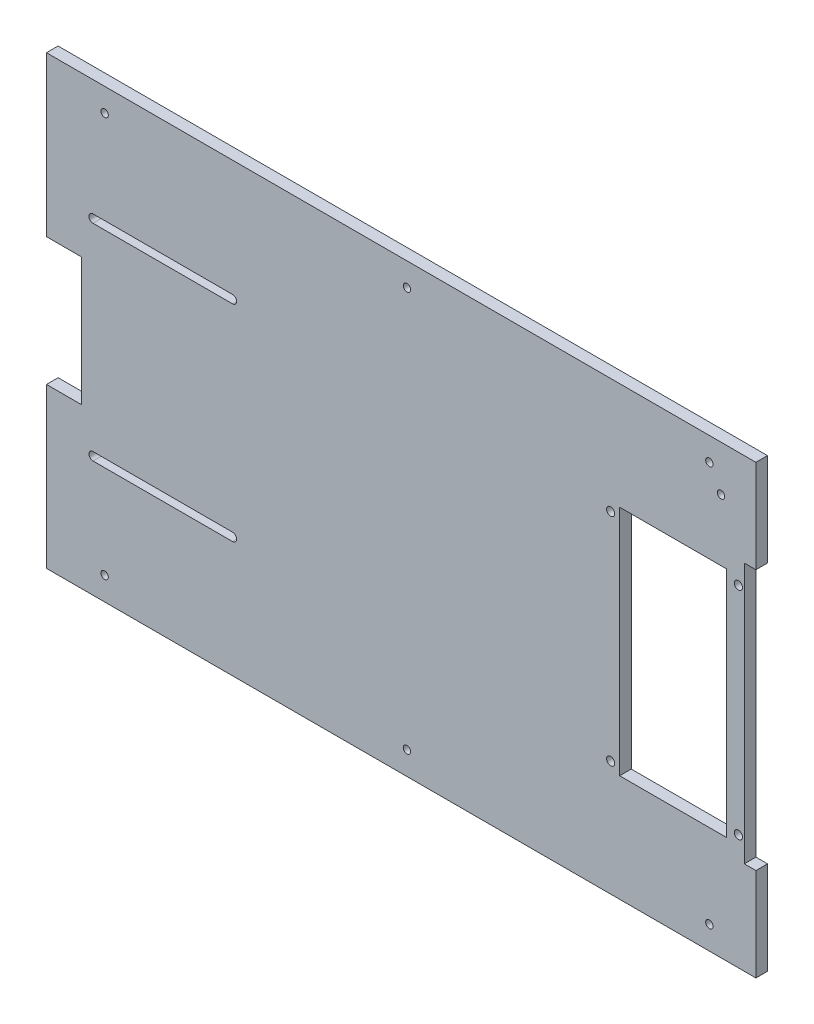
ISO-10303-21;
HEADER;
FILE_DESCRIPTION(('STEP AP214'),'2;1');
FILE_NAME('part.step','',(''),(''),'','','');
FILE_SCHEMA(('AUTOMOTIVE_DESIGN { 1 0 10303 214 1 1 1 1 }'));
ENDSEC;
DATA;
#1=APPLICATION_CONTEXT('core data for automotive mechanical design processes');
#2=APPLICATION_PROTOCOL_DEFINITION('international standard','automotive_design',2000,#1);
#3=PRODUCT_CONTEXT('',#1,'mechanical');
#4=PRODUCT('Part','Part','',(#3));
#5=PRODUCT_RELATED_PRODUCT_CATEGORY('part','',(#4));
#6=PRODUCT_DEFINITION_FORMATION('','',#4);
#7=PRODUCT_DEFINITION_CONTEXT('part definition',#1,'design');
#8=PRODUCT_DEFINITION('design','',#6,#7);
#9=PRODUCT_DEFINITION_SHAPE('','',#8);
#10=(LENGTH_UNIT() NAMED_UNIT(*) SI_UNIT(.MILLI.,.METRE.));
#11=(NAMED_UNIT(*) PLANE_ANGLE_UNIT() SI_UNIT($,.RADIAN.));
#12=(NAMED_UNIT(*) SI_UNIT($,.STERADIAN.) SOLID_ANGLE_UNIT());
#13=UNCERTAINTY_MEASURE_WITH_UNIT(LENGTH_MEASURE(1.E-05),#10,'distance_accuracy_value','');
#14=(GEOMETRIC_REPRESENTATION_CONTEXT(3) GLOBAL_UNCERTAINTY_ASSIGNED_CONTEXT((#13)) GLOBAL_UNIT_ASSIGNED_CONTEXT((#10,
#11,#12)) REPRESENTATION_CONTEXT('',''));
#15=CARTESIAN_POINT('',(0.,0.,0.));
#16=DIRECTION('',(0.,0.,1.));
#17=DIRECTION('',(1.,0.,0.));
#18=AXIS2_PLACEMENT_3D('',#15,#16,#17);
#19=CARTESIAN_POINT('',(150.,96.,5.));
#20=DIRECTION('',(-1.,0.,0.));
#21=DIRECTION('',(0.,-1.,0.));
#22=AXIS2_PLACEMENT_3D('',#19,#20,#21);
#23=PLANE('',#22);
#24=DIRECTION('',(0.,1.,0.));
#25=VECTOR('',#24,1.);
#26=CARTESIAN_POINT('',(150.,96.,5.));
#27=LINE('',#26,#25);
#28=CARTESIAN_POINT('',(150.,-56.,5.));
#29=VERTEX_POINT('',#28);
#30=CARTESIAN_POINT('',(150.,56.,5.));
#31=VERTEX_POINT('',#30);
#32=EDGE_CURVE('E49',#29,#31,#27,.T.);
#33=ORIENTED_EDGE('',*,*,#32,.F.);
#34=DIRECTION('',(0.,0.,-1.));
#35=VECTOR('',#34,1.);
#36=CARTESIAN_POINT('',(150.,-56.,45.3112887414927));
#37=LINE('',#36,#35);
#38=CARTESIAN_POINT('',(150.,-56.,0.));
#39=VERTEX_POINT('',#38);
#40=EDGE_CURVE('E218',#29,#39,#37,.T.);
#41=ORIENTED_EDGE('',*,*,#40,.T.);
#42=DIRECTION('',(0.,1.,0.));
#43=VECTOR('',#42,1.);
#44=CARTESIAN_POINT('',(150.,96.,0.));
#45=LINE('',#44,#43);
#46=CARTESIAN_POINT('',(150.,56.,0.));
#47=VERTEX_POINT('',#46);
#48=EDGE_CURVE('E432',#39,#47,#45,.T.);
#49=ORIENTED_EDGE('',*,*,#48,.T.);
#50=DIRECTION('',(0.,0.,-1.));
#51=VECTOR('',#50,1.);
#52=CARTESIAN_POINT('',(150.,56.,45.3112887414927));
#53=LINE('',#52,#51);
#54=EDGE_CURVE('E242',#31,#47,#53,.T.);
#55=ORIENTED_EDGE('',*,*,#54,.F.);
#56=EDGE_LOOP('',(#33,#41,#49,#55));
#57=FACE_BOUND('',#56,.T.);
#58=ADVANCED_FACE('F35',(#57),#23,.F.);
#59=CARTESIAN_POINT('',(-150.,96.,5.));
#60=DIRECTION('',(1.,0.,0.));
#61=DIRECTION('',(0.,0.,-1.));
#62=AXIS2_PLACEMENT_3D('',#59,#60,#61);
#63=PLANE('',#62);
#64=DIRECTION('',(0.,-1.,0.));
#65=VECTOR('',#64,1.);
#66=CARTESIAN_POINT('',(-150.,96.,5.));
#67=LINE('',#66,#65);
#68=CARTESIAN_POINT('',(-150.,-27.5,5.));
#69=VERTEX_POINT('',#68);
#70=CARTESIAN_POINT('',(-150.,-96.,5.));
#71=VERTEX_POINT('',#70);
#72=EDGE_CURVE('E438',#69,#71,#67,.T.);
#73=ORIENTED_EDGE('',*,*,#72,.F.);
#74=DIRECTION('',(0.,0.,1.));
#75=VECTOR('',#74,1.);
#76=CARTESIAN_POINT('',(-150.,-27.5,0.));
#77=LINE('',#76,#75);
#78=CARTESIAN_POINT('',(-150.,-27.5,0.));
#79=VERTEX_POINT('',#78);
#80=EDGE_CURVE('E373',#79,#69,#77,.T.);
#81=ORIENTED_EDGE('',*,*,#80,.F.);
#82=DIRECTION('',(0.,-1.,0.));
#83=VECTOR('',#82,1.);
#84=CARTESIAN_POINT('',(-150.,96.,0.));
#85=LINE('',#84,#83);
#86=CARTESIAN_POINT('',(-150.,-96.,0.));
#87=VERTEX_POINT('',#86);
#88=EDGE_CURVE('E447',#79,#87,#85,.T.);
#89=ORIENTED_EDGE('',*,*,#88,.T.);
#90=DIRECTION('',(0.,0.,-1.));
#91=VECTOR('',#90,1.);
#92=CARTESIAN_POINT('',(-150.,-96.,5.));
#93=LINE('',#92,#91);
#94=EDGE_CURVE('E42',#71,#87,#93,.T.);
#95=ORIENTED_EDGE('',*,*,#94,.F.);
#96=EDGE_LOOP('',(#73,#81,#89,#95));
#97=FACE_BOUND('',#96,.T.);
#98=ADVANCED_FACE('F454',(#97),#63,.F.);
#99=CARTESIAN_POINT('',(-150.,96.,5.));
#100=DIRECTION('',(0.,-1.,0.));
#101=DIRECTION('',(0.,0.,-1.));
#102=AXIS2_PLACEMENT_3D('',#99,#100,#101);
#103=PLANE('',#102);
#104=DIRECTION('',(-1.,0.,0.));
#105=VECTOR('',#104,1.);
#106=CARTESIAN_POINT('',(-150.,96.,0.));
#107=LINE('',#106,#105);
#108=CARTESIAN_POINT('',(155.,96.,0.));
#109=VERTEX_POINT('',#108);
#110=CARTESIAN_POINT('',(-150.,96.,0.));
#111=VERTEX_POINT('',#110);
#112=EDGE_CURVE('E445',#109,#111,#107,.T.);
#113=ORIENTED_EDGE('',*,*,#112,.T.);
#114=DIRECTION('',(0.,0.,-1.));
#115=VECTOR('',#114,1.);
#116=CARTESIAN_POINT('',(-150.,96.,5.));
#117=LINE('',#116,#115);
#118=CARTESIAN_POINT('',(-150.,96.,5.));
#119=VERTEX_POINT('',#118);
#120=EDGE_CURVE('E11',#119,#111,#117,.T.);
#121=ORIENTED_EDGE('',*,*,#120,.F.);
#122=DIRECTION('',(-1.,0.,0.));
#123=VECTOR('',#122,1.);
#124=CARTESIAN_POINT('',(-150.,96.,5.));
#125=LINE('',#124,#123);
#126=CARTESIAN_POINT('',(155.,96.,5.));
#127=VERTEX_POINT('',#126);
#128=EDGE_CURVE('E436',#127,#119,#125,.T.);
#129=ORIENTED_EDGE('',*,*,#128,.F.);
#130=DIRECTION('',(0.,0.,-1.));
#131=VECTOR('',#130,1.);
#132=CARTESIAN_POINT('',(155.,96.,45.3112887414927));
#133=LINE('',#132,#131);
#134=EDGE_CURVE('E236',#127,#109,#133,.T.);
#135=ORIENTED_EDGE('',*,*,#134,.T.);
#136=EDGE_LOOP('',(#113,#121,#129,#135));
#137=FACE_BOUND('',#136,.T.);
#138=ADVANCED_FACE('F471',(#137),#103,.F.);
#139=CARTESIAN_POINT('',(-150.,27.5,0.));
#140=VERTEX_POINT('',#139);
#141=EDGE_CURVE('E204',#111,#140,#85,.T.);
#142=ORIENTED_EDGE('',*,*,#141,.T.);
#143=DIRECTION('',(0.,0.,1.));
#144=VECTOR('',#143,1.);
#145=CARTESIAN_POINT('',(-150.,27.5,0.));
#146=LINE('',#145,#144);
#147=CARTESIAN_POINT('',(-150.,27.5,5.));
#148=VERTEX_POINT('',#147);
#149=EDGE_CURVE('E375',#140,#148,#146,.T.);
#150=ORIENTED_EDGE('',*,*,#149,.T.);
#151=EDGE_CURVE('E439',#119,#148,#67,.T.);
#152=ORIENTED_EDGE('',*,*,#151,.F.);
#153=ORIENTED_EDGE('',*,*,#120,.T.);
#154=EDGE_LOOP('',(#142,#150,#152,#153));
#155=FACE_BOUND('',#154,.T.);
#156=ADVANCED_FACE('F484',(#155),#63,.F.);
#157=CARTESIAN_POINT('',(-150.,-96.,5.));
#158=DIRECTION('',(0.,1.,0.));
#159=DIRECTION('',(0.,0.,1.));
#160=AXIS2_PLACEMENT_3D('',#157,#158,#159);
#161=PLANE('',#160);
#162=DIRECTION('',(1.,0.,0.));
#163=VECTOR('',#162,1.);
#164=CARTESIAN_POINT('',(-150.,-96.,0.));
#165=LINE('',#164,#163);
#166=CARTESIAN_POINT('',(155.,-96.,0.));
#167=VERTEX_POINT('',#166);
#168=EDGE_CURVE('E194',#87,#167,#165,.T.);
#169=ORIENTED_EDGE('',*,*,#168,.T.);
#170=DIRECTION('',(0.,0.,-1.));
#171=VECTOR('',#170,1.);
#172=CARTESIAN_POINT('',(155.,-96.,45.3112887414927));
#173=LINE('',#172,#171);
#174=CARTESIAN_POINT('',(155.,-96.,5.));
#175=VERTEX_POINT('',#174);
#176=EDGE_CURVE('E198',#175,#167,#173,.T.);
#177=ORIENTED_EDGE('',*,*,#176,.F.);
#178=DIRECTION('',(1.,0.,0.));
#179=VECTOR('',#178,1.);
#180=CARTESIAN_POINT('',(-150.,-96.,5.));
#181=LINE('',#180,#179);
#182=EDGE_CURVE('E442',#71,#175,#181,.T.);
#183=ORIENTED_EDGE('',*,*,#182,.F.);
#184=ORIENTED_EDGE('',*,*,#94,.T.);
#185=EDGE_LOOP('',(#169,#177,#183,#184));
#186=FACE_BOUND('',#185,.T.);
#187=ADVANCED_FACE('F196',(#186),#161,.F.);
#188=CARTESIAN_POINT('',(0.,0.,5.));
#189=DIRECTION('',(0.,0.,1.));
#190=DIRECTION('',(1.,0.,0.));
#191=AXIS2_PLACEMENT_3D('',#188,#189,#190);
#192=PLANE('',#191);
#193=CARTESIAN_POINT('',(140.000000000001,76.5,5.));
#194=DIRECTION('',(0.,0.,-1.));
#195=DIRECTION('',(-1.,0.,0.));
#196=AXIS2_PLACEMENT_3D('',#193,#194,#195);
#197=CIRCLE('',#196,1.59999999999999);
#198=CARTESIAN_POINT('',(138.400000000001,76.5,5.));
#199=VERTEX_POINT('',#198);
#200=EDGE_CURVE('E222',#199,#199,#197,.T.);
#201=ORIENTED_EDGE('',*,*,#200,.T.);
#202=EDGE_LOOP('',(#201));
#203=FACE_BOUND('',#202,.T.);
#204=CARTESIAN_POINT('',(135.,-86.,5.));
#205=DIRECTION('',(0.,0.,-1.));
#206=DIRECTION('',(1.,0.,0.));
#207=AXIS2_PLACEMENT_3D('',#204,#205,#206);
#208=CIRCLE('',#207,1.59999999999999);
#209=CARTESIAN_POINT('',(136.6,-86.,5.));
#210=VERTEX_POINT('',#209);
#211=EDGE_CURVE('E278',#210,#210,#208,.T.);
#212=ORIENTED_EDGE('',*,*,#211,.T.);
#213=EDGE_LOOP('',(#212));
#214=FACE_BOUND('',#213,.T.);
#215=CARTESIAN_POINT('',(5.,-86.,5.));
#216=DIRECTION('',(0.,0.,-1.));
#217=DIRECTION('',(1.,0.,0.));
#218=AXIS2_PLACEMENT_3D('',#215,#216,#217);
#219=CIRCLE('',#218,1.59999999999999);
#220=CARTESIAN_POINT('',(6.6,-86.,5.));
#221=VERTEX_POINT('',#220);
#222=EDGE_CURVE('E272',#221,#221,#219,.T.);
#223=ORIENTED_EDGE('',*,*,#222,.T.);
#224=EDGE_LOOP('',(#223));
#225=FACE_BOUND('',#224,.T.);
#226=CARTESIAN_POINT('',(-125.,-86.,5.));
#227=DIRECTION('',(0.,0.,-1.));
#228=DIRECTION('',(1.,0.,0.));
#229=AXIS2_PLACEMENT_3D('',#226,#227,#228);
#230=CIRCLE('',#229,1.59999999999999);
#231=CARTESIAN_POINT('',(-123.4,-86.,5.));
#232=VERTEX_POINT('',#231);
#233=EDGE_CURVE('E266',#232,#232,#230,.T.);
#234=ORIENTED_EDGE('',*,*,#233,.T.);
#235=EDGE_LOOP('',(#234));
#236=FACE_BOUND('',#235,.T.);
#237=CARTESIAN_POINT('',(-125.,86.,5.));
#238=DIRECTION('',(0.,0.,-1.));
#239=DIRECTION('',(-1.,0.,0.));
#240=AXIS2_PLACEMENT_3D('',#237,#238,#239);
#241=CIRCLE('',#240,1.59999999999999);
#242=CARTESIAN_POINT('',(-126.6,86.,5.));
#243=VERTEX_POINT('',#242);
#244=EDGE_CURVE('E260',#243,#243,#241,.T.);
#245=ORIENTED_EDGE('',*,*,#244,.T.);
#246=EDGE_LOOP('',(#245));
#247=FACE_BOUND('',#246,.T.);
#248=CARTESIAN_POINT('',(5.,86.,5.));
#249=DIRECTION('',(0.,0.,-1.));
#250=DIRECTION('',(-1.,0.,0.));
#251=AXIS2_PLACEMENT_3D('',#248,#249,#250);
#252=CIRCLE('',#251,1.59999999999999);
#253=CARTESIAN_POINT('',(3.40000000000001,86.,5.));
#254=VERTEX_POINT('',#253);
#255=EDGE_CURVE('E253',#254,#254,#252,.T.);
#256=ORIENTED_EDGE('',*,*,#255,.T.);
#257=EDGE_LOOP('',(#256));
#258=FACE_BOUND('',#257,.T.);
#259=CARTESIAN_POINT('',(135.,86.,5.));
#260=DIRECTION('',(0.,0.,-1.));
#261=DIRECTION('',(-1.,0.,0.));
#262=AXIS2_PLACEMENT_3D('',#259,#260,#261);
#263=CIRCLE('',#262,1.59999999999999);
#264=CARTESIAN_POINT('',(133.4,86.,5.));
#265=VERTEX_POINT('',#264);
#266=EDGE_CURVE('E283',#265,#265,#263,.T.);
#267=ORIENTED_EDGE('',*,*,#266,.T.);
#268=EDGE_LOOP('',(#267));
#269=FACE_BOUND('',#268,.T.);
#270=CARTESIAN_POINT('',(-70.,44.25,5.));
#271=DIRECTION('',(0.,0.,1.));
#272=DIRECTION('',(1.,0.,0.));
#273=AXIS2_PLACEMENT_3D('',#270,#271,#272);
#274=CIRCLE('',#273,1.75000000000001);
#275=CARTESIAN_POINT('',(-70.,42.5,5.));
#276=VERTEX_POINT('',#275);
#277=CARTESIAN_POINT('',(-70.,46.,5.));
#278=VERTEX_POINT('',#277);
#279=EDGE_CURVE('E303',#276,#278,#274,.T.);
#280=ORIENTED_EDGE('',*,*,#279,.F.);
#281=DIRECTION('',(1.,0.,0.));
#282=VECTOR('',#281,1.);
#283=CARTESIAN_POINT('',(-70.,42.5,5.));
#284=LINE('',#283,#282);
#285=CARTESIAN_POINT('',(-130.,42.5,5.));
#286=VERTEX_POINT('',#285);
#287=EDGE_CURVE('E293',#286,#276,#284,.T.);
#288=ORIENTED_EDGE('',*,*,#287,.F.);
#289=CARTESIAN_POINT('',(-130.,44.25,5.));
#290=DIRECTION('',(0.,0.,1.));
#291=DIRECTION('',(1.,0.,0.));
#292=AXIS2_PLACEMENT_3D('',#289,#290,#291);
#293=CIRCLE('',#292,1.75000000000001);
#294=CARTESIAN_POINT('',(-130.,46.,5.));
#295=VERTEX_POINT('',#294);
#296=EDGE_CURVE('E309',#295,#286,#293,.T.);
#297=ORIENTED_EDGE('',*,*,#296,.F.);
#298=DIRECTION('',(-1.,0.,0.));
#299=VECTOR('',#298,1.);
#300=CARTESIAN_POINT('',(-70.,46.,5.));
#301=LINE('',#300,#299);
#302=EDGE_CURVE('E305',#278,#295,#301,.T.);
#303=ORIENTED_EDGE('',*,*,#302,.F.);
#304=EDGE_LOOP('',(#280,#288,#297,#303));
#305=FACE_BOUND('',#304,.T.);
#306=CARTESIAN_POINT('',(-70.,-44.25,5.));
#307=DIRECTION('',(0.,0.,1.));
#308=DIRECTION('',(-1.,0.,0.));
#309=AXIS2_PLACEMENT_3D('',#306,#307,#308);
#310=CIRCLE('',#309,1.75000000000001);
#311=CARTESIAN_POINT('',(-70.,-46.,5.));
#312=VERTEX_POINT('',#311);
#313=CARTESIAN_POINT('',(-70.,-42.5,5.));
#314=VERTEX_POINT('',#313);
#315=EDGE_CURVE('E337',#312,#314,#310,.T.);
#316=ORIENTED_EDGE('',*,*,#315,.F.);
#317=DIRECTION('',(1.,0.,0.));
#318=VECTOR('',#317,1.);
#319=CARTESIAN_POINT('',(-70.,-46.,5.));
#320=LINE('',#319,#318);
#321=CARTESIAN_POINT('',(-130.,-46.,5.));
#322=VERTEX_POINT('',#321);
#323=EDGE_CURVE('E327',#322,#312,#320,.T.);
#324=ORIENTED_EDGE('',*,*,#323,.F.);
#325=CARTESIAN_POINT('',(-130.,-44.25,5.));
#326=DIRECTION('',(0.,0.,1.));
#327=DIRECTION('',(-1.,0.,0.));
#328=AXIS2_PLACEMENT_3D('',#325,#326,#327);
#329=CIRCLE('',#328,1.75000000000001);
#330=CARTESIAN_POINT('',(-130.,-42.5,5.));
#331=VERTEX_POINT('',#330);
#332=EDGE_CURVE('E343',#331,#322,#329,.T.);
#333=ORIENTED_EDGE('',*,*,#332,.F.);
#334=DIRECTION('',(-1.,0.,0.));
#335=VECTOR('',#334,1.);
#336=CARTESIAN_POINT('',(-70.,-42.5,5.));
#337=LINE('',#336,#335);
#338=EDGE_CURVE('E339',#314,#331,#337,.T.);
#339=ORIENTED_EDGE('',*,*,#338,.F.);
#340=EDGE_LOOP('',(#316,#324,#333,#339));
#341=FACE_BOUND('',#340,.T.);
#342=DIRECTION('',(1.,0.,0.));
#343=VECTOR('',#342,1.);
#344=CARTESIAN_POINT('',(-135.,-27.5,5.));
#345=LINE('',#344,#343);
#346=CARTESIAN_POINT('',(-135.,-27.5,5.));
#347=VERTEX_POINT('',#346);
#348=EDGE_CURVE('E359',#69,#347,#345,.T.);
#349=ORIENTED_EDGE('',*,*,#348,.F.);
#350=ORIENTED_EDGE('',*,*,#72,.T.);
#351=ORIENTED_EDGE('',*,*,#182,.T.);
#352=DIRECTION('',(0.,-1.,0.));
#353=VECTOR('',#352,1.);
#354=CARTESIAN_POINT('',(155.,-96.,5.));
#355=LINE('',#354,#353);
#356=CARTESIAN_POINT('',(155.,-56.,5.));
#357=VERTEX_POINT('',#356);
#358=EDGE_CURVE('E211',#357,#175,#355,.T.);
#359=ORIENTED_EDGE('',*,*,#358,.F.);
#360=DIRECTION('',(1.,0.,0.));
#361=VECTOR('',#360,1.);
#362=CARTESIAN_POINT('',(150.,-56.,5.));
#363=LINE('',#362,#361);
#364=EDGE_CURVE('E220',#29,#357,#363,.T.);
#365=ORIENTED_EDGE('',*,*,#364,.F.);
#366=ORIENTED_EDGE('',*,*,#32,.T.);
#367=DIRECTION('',(-1.,0.,0.));
#368=VECTOR('',#367,1.);
#369=CARTESIAN_POINT('',(150.,56.,5.));
#370=LINE('',#369,#368);
#371=CARTESIAN_POINT('',(155.,56.,5.));
#372=VERTEX_POINT('',#371);
#373=EDGE_CURVE('E239',#372,#31,#370,.T.);
#374=ORIENTED_EDGE('',*,*,#373,.F.);
#375=DIRECTION('',(0.,-1.,0.));
#376=VECTOR('',#375,1.);
#377=CARTESIAN_POINT('',(155.,96.,5.));
#378=LINE('',#377,#376);
#379=EDGE_CURVE('E244',#127,#372,#378,.T.);
#380=ORIENTED_EDGE('',*,*,#379,.F.);
#381=ORIENTED_EDGE('',*,*,#128,.T.);
#382=ORIENTED_EDGE('',*,*,#151,.T.);
#383=DIRECTION('',(-1.,0.,0.));
#384=VECTOR('',#383,1.);
#385=CARTESIAN_POINT('',(-135.,27.5,5.));
#386=LINE('',#385,#384);
#387=CARTESIAN_POINT('',(-135.,27.5,5.));
#388=VERTEX_POINT('',#387);
#389=EDGE_CURVE('E368',#388,#148,#386,.T.);
#390=ORIENTED_EDGE('',*,*,#389,.F.);
#391=DIRECTION('',(0.,1.,0.));
#392=VECTOR('',#391,1.);
#393=CARTESIAN_POINT('',(-135.,27.5,5.));
#394=LINE('',#393,#392);
#395=EDGE_CURVE('E286',#347,#388,#394,.T.);
#396=ORIENTED_EDGE('',*,*,#395,.F.);
#397=EDGE_LOOP('',(#349,#350,#351,#359,#365,#366,#374,#380,#381,#382,#390,#396));
#398=FACE_BOUND('',#397,.T.);
#399=DIRECTION('',(0.,-1.,0.));
#400=VECTOR('',#399,1.);
#401=CARTESIAN_POINT('',(96.4149907175586,50.,5.));
#402=LINE('',#401,#400);
#403=CARTESIAN_POINT('',(96.4149907175586,50.,5.));
#404=VERTEX_POINT('',#403);
#405=CARTESIAN_POINT('',(96.4149907175586,-50.,5.));
#406=VERTEX_POINT('',#405);
#407=EDGE_CURVE('E316',#404,#406,#402,.T.);
#408=ORIENTED_EDGE('',*,*,#407,.F.);
#409=DIRECTION('',(-1.,0.,0.));
#410=VECTOR('',#409,1.);
#411=CARTESIAN_POINT('',(142.414990717559,50.,5.));
#412=LINE('',#411,#410);
#413=CARTESIAN_POINT('',(142.414990717559,50.,5.));
#414=VERTEX_POINT('',#413);
#415=EDGE_CURVE('E383',#414,#404,#412,.T.);
#416=ORIENTED_EDGE('',*,*,#415,.F.);
#417=DIRECTION('',(0.,1.,0.));
#418=VECTOR('',#417,1.);
#419=CARTESIAN_POINT('',(142.414990717559,50.,5.));
#420=LINE('',#419,#418);
#421=CARTESIAN_POINT('',(142.414990717559,-50.,5.));
#422=VERTEX_POINT('',#421);
#423=EDGE_CURVE('E397',#422,#414,#420,.T.);
#424=ORIENTED_EDGE('',*,*,#423,.F.);
#425=DIRECTION('',(1.,0.,0.));
#426=VECTOR('',#425,1.);
#427=CARTESIAN_POINT('',(142.414990717559,-50.,5.));
#428=LINE('',#427,#426);
#429=EDGE_CURVE('E394',#406,#422,#428,.T.);
#430=ORIENTED_EDGE('',*,*,#429,.F.);
#431=EDGE_LOOP('',(#408,#416,#424,#430));
#432=FACE_BOUND('',#431,.T.);
#433=CARTESIAN_POINT('',(147.46,-46.46,5.));
#434=DIRECTION('',(0.,0.,-1.));
#435=DIRECTION('',(-1.,0.,0.));
#436=AXIS2_PLACEMENT_3D('',#433,#434,#435);
#437=CIRCLE('',#436,1.75000000000001);
#438=CARTESIAN_POINT('',(145.71,-46.46,5.));
#439=VERTEX_POINT('',#438);
#440=EDGE_CURVE('E417',#439,#439,#437,.T.);
#441=ORIENTED_EDGE('',*,*,#440,.T.);
#442=EDGE_LOOP('',(#441));
#443=FACE_BOUND('',#442,.T.);
#444=CARTESIAN_POINT('',(92.5400000000001,46.46,5.));
#445=DIRECTION('',(0.,0.,-1.));
#446=DIRECTION('',(-1.,0.,0.));
#447=AXIS2_PLACEMENT_3D('',#444,#445,#446);
#448=CIRCLE('',#447,1.75);
#449=CARTESIAN_POINT('',(90.7900000000001,46.46,5.));
#450=VERTEX_POINT('',#449);
#451=EDGE_CURVE('E424',#450,#450,#448,.T.);
#452=ORIENTED_EDGE('',*,*,#451,.T.);
#453=EDGE_LOOP('',(#452));
#454=FACE_BOUND('',#453,.T.);
#455=CARTESIAN_POINT('',(92.5400000000001,-46.46,5.));
#456=DIRECTION('',(0.,0.,-1.));
#457=DIRECTION('',(-1.,0.,0.));
#458=AXIS2_PLACEMENT_3D('',#455,#456,#457);
#459=CIRCLE('',#458,1.75);
#460=CARTESIAN_POINT('',(90.7900000000001,-46.46,5.));
#461=VERTEX_POINT('',#460);
#462=EDGE_CURVE('E411',#461,#461,#459,.T.);
#463=ORIENTED_EDGE('',*,*,#462,.T.);
#464=EDGE_LOOP('',(#463));
#465=FACE_BOUND('',#464,.T.);
#466=CARTESIAN_POINT('',(147.46,46.46,5.));
#467=DIRECTION('',(0.,0.,-1.));
#468=DIRECTION('',(-1.,0.,0.));
#469=AXIS2_PLACEMENT_3D('',#466,#467,#468);
#470=CIRCLE('',#469,1.74999999999998);
#471=CARTESIAN_POINT('',(145.71,46.46,5.));
#472=VERTEX_POINT('',#471);
#473=EDGE_CURVE('E429',#472,#472,#470,.T.);
#474=ORIENTED_EDGE('',*,*,#473,.T.);
#475=EDGE_LOOP('',(#474));
#476=FACE_BOUND('',#475,.T.);
#477=ADVANCED_FACE('F481',(#203,#214,#225,#236,#247,#258,#269,#305,#341,#398,#432,#443,#454,
#465,#476),#192,.T.);
#478=CARTESIAN_POINT('',(0.,0.,0.));
#479=DIRECTION('',(0.,0.,1.));
#480=DIRECTION('',(1.,0.,0.));
#481=AXIS2_PLACEMENT_3D('',#478,#479,#480);
#482=PLANE('',#481);
#483=CARTESIAN_POINT('',(140.000000000001,76.5,0.));
#484=DIRECTION('',(0.,0.,-1.));
#485=DIRECTION('',(-1.,0.,0.));
#486=AXIS2_PLACEMENT_3D('',#483,#484,#485);
#487=CIRCLE('',#486,1.59999999999999);
#488=CARTESIAN_POINT('',(138.400000000001,76.5,0.));
#489=VERTEX_POINT('',#488);
#490=EDGE_CURVE('E225',#489,#489,#487,.T.);
#491=ORIENTED_EDGE('',*,*,#490,.F.);
#492=EDGE_LOOP('',(#491));
#493=FACE_BOUND('',#492,.T.);
#494=CARTESIAN_POINT('',(135.,-86.,0.));
#495=DIRECTION('',(0.,0.,-1.));
#496=DIRECTION('',(1.,0.,0.));
#497=AXIS2_PLACEMENT_3D('',#494,#495,#496);
#498=CIRCLE('',#497,1.59999999999999);
#499=CARTESIAN_POINT('',(136.6,-86.,0.));
#500=VERTEX_POINT('',#499);
#501=EDGE_CURVE('E249',#500,#500,#498,.T.);
#502=ORIENTED_EDGE('',*,*,#501,.F.);
#503=EDGE_LOOP('',(#502));
#504=FACE_BOUND('',#503,.T.);
#505=CARTESIAN_POINT('',(5.,-86.,0.));
#506=DIRECTION('',(0.,0.,-1.));
#507=DIRECTION('',(1.,0.,0.));
#508=AXIS2_PLACEMENT_3D('',#505,#506,#507);
#509=CIRCLE('',#508,1.59999999999999);
#510=CARTESIAN_POINT('',(6.6,-86.,0.));
#511=VERTEX_POINT('',#510);
#512=EDGE_CURVE('E275',#511,#511,#509,.T.);
#513=ORIENTED_EDGE('',*,*,#512,.F.);
#514=EDGE_LOOP('',(#513));
#515=FACE_BOUND('',#514,.T.);
#516=CARTESIAN_POINT('',(-125.,-86.,0.));
#517=DIRECTION('',(0.,0.,-1.));
#518=DIRECTION('',(1.,0.,0.));
#519=AXIS2_PLACEMENT_3D('',#516,#517,#518);
#520=CIRCLE('',#519,1.59999999999999);
#521=CARTESIAN_POINT('',(-123.4,-86.,0.));
#522=VERTEX_POINT('',#521);
#523=EDGE_CURVE('E269',#522,#522,#520,.T.);
#524=ORIENTED_EDGE('',*,*,#523,.F.);
#525=EDGE_LOOP('',(#524));
#526=FACE_BOUND('',#525,.T.);
#527=CARTESIAN_POINT('',(-125.,86.,0.));
#528=DIRECTION('',(0.,0.,-1.));
#529=DIRECTION('',(-1.,0.,0.));
#530=AXIS2_PLACEMENT_3D('',#527,#528,#529);
#531=CIRCLE('',#530,1.59999999999999);
#532=CARTESIAN_POINT('',(-126.6,86.,0.));
#533=VERTEX_POINT('',#532);
#534=EDGE_CURVE('E263',#533,#533,#531,.T.);
#535=ORIENTED_EDGE('',*,*,#534,.F.);
#536=EDGE_LOOP('',(#535));
#537=FACE_BOUND('',#536,.T.);
#538=CARTESIAN_POINT('',(5.,86.,0.));
#539=DIRECTION('',(0.,0.,-1.));
#540=DIRECTION('',(-1.,0.,0.));
#541=AXIS2_PLACEMENT_3D('',#538,#539,#540);
#542=CIRCLE('',#541,1.59999999999999);
#543=CARTESIAN_POINT('',(3.40000000000001,86.,0.));
#544=VERTEX_POINT('',#543);
#545=EDGE_CURVE('E257',#544,#544,#542,.T.);
#546=ORIENTED_EDGE('',*,*,#545,.F.);
#547=EDGE_LOOP('',(#546));
#548=FACE_BOUND('',#547,.T.);
#549=CARTESIAN_POINT('',(135.,86.,0.));
#550=DIRECTION('',(0.,0.,-1.));
#551=DIRECTION('',(-1.,0.,0.));
#552=AXIS2_PLACEMENT_3D('',#549,#550,#551);
#553=CIRCLE('',#552,1.59999999999999);
#554=CARTESIAN_POINT('',(133.4,86.,0.));
#555=VERTEX_POINT('',#554);
#556=EDGE_CURVE('E256',#555,#555,#553,.T.);
#557=ORIENTED_EDGE('',*,*,#556,.F.);
#558=EDGE_LOOP('',(#557));
#559=FACE_BOUND('',#558,.T.);
#560=DIRECTION('',(1.,0.,0.));
#561=VECTOR('',#560,1.);
#562=CARTESIAN_POINT('',(-70.,42.5,0.));
#563=LINE('',#562,#561);
#564=CARTESIAN_POINT('',(-130.,42.5,0.));
#565=VERTEX_POINT('',#564);
#566=CARTESIAN_POINT('',(-70.,42.5,0.));
#567=VERTEX_POINT('',#566);
#568=EDGE_CURVE('E299',#565,#567,#563,.T.);
#569=ORIENTED_EDGE('',*,*,#568,.T.);
#570=CARTESIAN_POINT('',(-70.,44.25,0.));
#571=DIRECTION('',(0.,0.,1.));
#572=DIRECTION('',(1.,0.,0.));
#573=AXIS2_PLACEMENT_3D('',#570,#571,#572);
#574=CIRCLE('',#573,1.75000000000001);
#575=CARTESIAN_POINT('',(-70.,46.,0.));
#576=VERTEX_POINT('',#575);
#577=EDGE_CURVE('E289',#567,#576,#574,.T.);
#578=ORIENTED_EDGE('',*,*,#577,.T.);
#579=DIRECTION('',(-1.,0.,0.));
#580=VECTOR('',#579,1.);
#581=CARTESIAN_POINT('',(-70.,46.,0.));
#582=LINE('',#581,#580);
#583=CARTESIAN_POINT('',(-130.,46.,0.));
#584=VERTEX_POINT('',#583);
#585=EDGE_CURVE('E292',#576,#584,#582,.T.);
#586=ORIENTED_EDGE('',*,*,#585,.T.);
#587=CARTESIAN_POINT('',(-130.,44.25,0.));
#588=DIRECTION('',(0.,0.,1.));
#589=DIRECTION('',(1.,0.,0.));
#590=AXIS2_PLACEMENT_3D('',#587,#588,#589);
#591=CIRCLE('',#590,1.75000000000001);
#592=EDGE_CURVE('E296',#584,#565,#591,.T.);
#593=ORIENTED_EDGE('',*,*,#592,.T.);
#594=EDGE_LOOP('',(#569,#578,#586,#593));
#595=FACE_BOUND('',#594,.T.);
#596=DIRECTION('',(1.,0.,0.));
#597=VECTOR('',#596,1.);
#598=CARTESIAN_POINT('',(-70.,-46.,0.));
#599=LINE('',#598,#597);
#600=CARTESIAN_POINT('',(-130.,-46.,0.));
#601=VERTEX_POINT('',#600);
#602=CARTESIAN_POINT('',(-70.,-46.,0.));
#603=VERTEX_POINT('',#602);
#604=EDGE_CURVE('E333',#601,#603,#599,.T.);
#605=ORIENTED_EDGE('',*,*,#604,.T.);
#606=CARTESIAN_POINT('',(-70.,-44.25,0.));
#607=DIRECTION('',(0.,0.,1.));
#608=DIRECTION('',(-1.,0.,0.));
#609=AXIS2_PLACEMENT_3D('',#606,#607,#608);
#610=CIRCLE('',#609,1.75000000000001);
#611=CARTESIAN_POINT('',(-70.,-42.5,0.));
#612=VERTEX_POINT('',#611);
#613=EDGE_CURVE('E323',#603,#612,#610,.T.);
#614=ORIENTED_EDGE('',*,*,#613,.T.);
#615=DIRECTION('',(-1.,0.,0.));
#616=VECTOR('',#615,1.);
#617=CARTESIAN_POINT('',(-70.,-42.5,0.));
#618=LINE('',#617,#616);
#619=CARTESIAN_POINT('',(-130.,-42.5,0.));
#620=VERTEX_POINT('',#619);
#621=EDGE_CURVE('E326',#612,#620,#618,.T.);
#622=ORIENTED_EDGE('',*,*,#621,.T.);
#623=CARTESIAN_POINT('',(-130.,-44.25,0.));
#624=DIRECTION('',(0.,0.,1.));
#625=DIRECTION('',(-1.,0.,0.));
#626=AXIS2_PLACEMENT_3D('',#623,#624,#625);
#627=CIRCLE('',#626,1.75000000000001);
#628=EDGE_CURVE('E330',#620,#601,#627,.T.);
#629=ORIENTED_EDGE('',*,*,#628,.T.);
#630=EDGE_LOOP('',(#605,#614,#622,#629));
#631=FACE_BOUND('',#630,.T.);
#632=DIRECTION('',(-1.,0.,0.));
#633=VECTOR('',#632,1.);
#634=CARTESIAN_POINT('',(142.414990717559,50.,0.));
#635=LINE('',#634,#633);
#636=CARTESIAN_POINT('',(142.414990717559,50.,0.));
#637=VERTEX_POINT('',#636);
#638=CARTESIAN_POINT('',(96.4149907175586,50.,0.));
#639=VERTEX_POINT('',#638);
#640=EDGE_CURVE('E389',#637,#639,#635,.T.);
#641=ORIENTED_EDGE('',*,*,#640,.T.);
#642=DIRECTION('',(0.,-1.,0.));
#643=VECTOR('',#642,1.);
#644=CARTESIAN_POINT('',(96.4149907175586,50.,0.));
#645=LINE('',#644,#643);
#646=CARTESIAN_POINT('',(96.4149907175586,-50.,0.));
#647=VERTEX_POINT('',#646);
#648=EDGE_CURVE('E379',#639,#647,#645,.T.);
#649=ORIENTED_EDGE('',*,*,#648,.T.);
#650=DIRECTION('',(1.,0.,0.));
#651=VECTOR('',#650,1.);
#652=CARTESIAN_POINT('',(142.414990717559,-50.,0.));
#653=LINE('',#652,#651);
#654=CARTESIAN_POINT('',(142.414990717559,-50.,0.));
#655=VERTEX_POINT('',#654);
#656=EDGE_CURVE('E382',#647,#655,#653,.T.);
#657=ORIENTED_EDGE('',*,*,#656,.T.);
#658=DIRECTION('',(0.,1.,0.));
#659=VECTOR('',#658,1.);
#660=CARTESIAN_POINT('',(142.414990717559,50.,0.));
#661=LINE('',#660,#659);
#662=EDGE_CURVE('E386',#655,#637,#661,.T.);
#663=ORIENTED_EDGE('',*,*,#662,.T.);
#664=EDGE_LOOP('',(#641,#649,#657,#663));
#665=FACE_BOUND('',#664,.T.);
#666=CARTESIAN_POINT('',(147.46,-46.46,0.));
#667=DIRECTION('',(0.,0.,-1.));
#668=DIRECTION('',(-1.,0.,0.));
#669=AXIS2_PLACEMENT_3D('',#666,#667,#668);
#670=CIRCLE('',#669,1.75000000000001);
#671=CARTESIAN_POINT('',(145.71,-46.46,0.));
#672=VERTEX_POINT('',#671);
#673=EDGE_CURVE('E421',#672,#672,#670,.T.);
#674=ORIENTED_EDGE('',*,*,#673,.F.);
#675=EDGE_LOOP('',(#674));
#676=FACE_BOUND('',#675,.T.);
#677=CARTESIAN_POINT('',(92.5400000000001,46.46,0.));
#678=DIRECTION('',(0.,0.,-1.));
#679=DIRECTION('',(-1.,0.,0.));
#680=AXIS2_PLACEMENT_3D('',#677,#678,#679);
#681=CIRCLE('',#680,1.75);
#682=CARTESIAN_POINT('',(90.7900000000001,46.46,0.));
#683=VERTEX_POINT('',#682);
#684=EDGE_CURVE('E414',#683,#683,#681,.T.);
#685=ORIENTED_EDGE('',*,*,#684,.F.);
#686=EDGE_LOOP('',(#685));
#687=FACE_BOUND('',#686,.T.);
#688=CARTESIAN_POINT('',(92.5400000000001,-46.46,0.));
#689=DIRECTION('',(0.,0.,-1.));
#690=DIRECTION('',(-1.,0.,0.));
#691=AXIS2_PLACEMENT_3D('',#688,#689,#690);
#692=CIRCLE('',#691,1.75);
#693=CARTESIAN_POINT('',(90.7900000000001,-46.46,0.));
#694=VERTEX_POINT('',#693);
#695=EDGE_CURVE('E404',#694,#694,#692,.T.);
#696=ORIENTED_EDGE('',*,*,#695,.F.);
#697=EDGE_LOOP('',(#696));
#698=FACE_BOUND('',#697,.T.);
#699=CARTESIAN_POINT('',(147.46,46.46,0.));
#700=DIRECTION('',(0.,0.,-1.));
#701=DIRECTION('',(-1.,0.,0.));
#702=AXIS2_PLACEMENT_3D('',#699,#700,#701);
#703=CIRCLE('',#702,1.74999999999998);
#704=CARTESIAN_POINT('',(145.71,46.46,0.));
#705=VERTEX_POINT('',#704);
#706=EDGE_CURVE('E420',#705,#705,#703,.T.);
#707=ORIENTED_EDGE('',*,*,#706,.F.);
#708=EDGE_LOOP('',(#707));
#709=FACE_BOUND('',#708,.T.);
#710=ORIENTED_EDGE('',*,*,#88,.F.);
#711=DIRECTION('',(1.,0.,0.));
#712=VECTOR('',#711,1.);
#713=CARTESIAN_POINT('',(-135.,-27.5,0.));
#714=LINE('',#713,#712);
#715=CARTESIAN_POINT('',(-135.,-27.5,0.));
#716=VERTEX_POINT('',#715);
#717=EDGE_CURVE('E362',#79,#716,#714,.T.);
#718=ORIENTED_EDGE('',*,*,#717,.T.);
#719=DIRECTION('',(0.,1.,0.));
#720=VECTOR('',#719,1.);
#721=CARTESIAN_POINT('',(-135.,27.5,0.));
#722=LINE('',#721,#720);
#723=CARTESIAN_POINT('',(-135.,27.5,0.));
#724=VERTEX_POINT('',#723);
#725=EDGE_CURVE('E355',#716,#724,#722,.T.);
#726=ORIENTED_EDGE('',*,*,#725,.T.);
#727=DIRECTION('',(-1.,0.,0.));
#728=VECTOR('',#727,1.);
#729=CARTESIAN_POINT('',(-135.,27.5,0.));
#730=LINE('',#729,#728);
#731=EDGE_CURVE('E358',#724,#140,#730,.T.);
#732=ORIENTED_EDGE('',*,*,#731,.T.);
#733=ORIENTED_EDGE('',*,*,#141,.F.);
#734=ORIENTED_EDGE('',*,*,#112,.F.);
#735=DIRECTION('',(0.,-1.,0.));
#736=VECTOR('',#735,1.);
#737=CARTESIAN_POINT('',(155.,96.,0.));
#738=LINE('',#737,#736);
#739=CARTESIAN_POINT('',(155.,56.,0.));
#740=VERTEX_POINT('',#739);
#741=EDGE_CURVE('E212',#109,#740,#738,.T.);
#742=ORIENTED_EDGE('',*,*,#741,.T.);
#743=DIRECTION('',(-1.,0.,0.));
#744=VECTOR('',#743,1.);
#745=CARTESIAN_POINT('',(150.,56.,0.));
#746=LINE('',#745,#744);
#747=EDGE_CURVE('E233',#740,#47,#746,.T.);
#748=ORIENTED_EDGE('',*,*,#747,.T.);
#749=ORIENTED_EDGE('',*,*,#48,.F.);
#750=DIRECTION('',(1.,0.,0.));
#751=VECTOR('',#750,1.);
#752=CARTESIAN_POINT('',(150.,-56.,0.));
#753=LINE('',#752,#751);
#754=CARTESIAN_POINT('',(155.,-56.,0.));
#755=VERTEX_POINT('',#754);
#756=EDGE_CURVE('E217',#39,#755,#753,.T.);
#757=ORIENTED_EDGE('',*,*,#756,.T.);
#758=DIRECTION('',(0.,-1.,0.));
#759=VECTOR('',#758,1.);
#760=CARTESIAN_POINT('',(155.,-96.,0.));
#761=LINE('',#760,#759);
#762=EDGE_CURVE('E210',#755,#167,#761,.T.);
#763=ORIENTED_EDGE('',*,*,#762,.T.);
#764=ORIENTED_EDGE('',*,*,#168,.F.);
#765=EDGE_LOOP('',(#710,#718,#726,#732,#733,#734,#742,#748,#749,#757,#763,#764));
#766=FACE_BOUND('',#765,.T.);
#767=ADVANCED_FACE('F215',(#493,#504,#515,#526,#537,#548,#559,#595,#631,#665,#676,#687,#698,
#709,#766),#482,.F.);
#768=CARTESIAN_POINT('',(147.46,46.46,5.));
#769=DIRECTION('',(0.,0.,-1.));
#770=DIRECTION('',(-1.,0.,0.));
#771=AXIS2_PLACEMENT_3D('',#768,#769,#770);
#772=CYLINDRICAL_SURFACE('',#771,1.74999999999998);
#773=ORIENTED_EDGE('',*,*,#473,.F.);
#774=EDGE_LOOP('',(#773));
#775=FACE_BOUND('',#774,.T.);
#776=ORIENTED_EDGE('',*,*,#706,.T.);
#777=EDGE_LOOP('',(#776));
#778=FACE_BOUND('',#777,.T.);
#779=ADVANCED_FACE('F568',(#775,#778),#772,.F.);
#780=CARTESIAN_POINT('',(92.5400000000001,-46.46,5.));
#781=DIRECTION('',(0.,0.,-1.));
#782=DIRECTION('',(-1.,0.,0.));
#783=AXIS2_PLACEMENT_3D('',#780,#781,#782);
#784=CYLINDRICAL_SURFACE('',#783,1.75);
#785=ORIENTED_EDGE('',*,*,#462,.F.);
#786=EDGE_LOOP('',(#785));
#787=FACE_BOUND('',#786,.T.);
#788=ORIENTED_EDGE('',*,*,#695,.T.);
#789=EDGE_LOOP('',(#788));
#790=FACE_BOUND('',#789,.T.);
#791=ADVANCED_FACE('F658',(#787,#790),#784,.F.);
#792=CARTESIAN_POINT('',(92.5400000000001,46.46,5.));
#793=DIRECTION('',(0.,0.,-1.));
#794=DIRECTION('',(-1.,0.,0.));
#795=AXIS2_PLACEMENT_3D('',#792,#793,#794);
#796=CYLINDRICAL_SURFACE('',#795,1.75);
#797=ORIENTED_EDGE('',*,*,#451,.F.);
#798=EDGE_LOOP('',(#797));
#799=FACE_BOUND('',#798,.T.);
#800=ORIENTED_EDGE('',*,*,#684,.T.);
#801=EDGE_LOOP('',(#800));
#802=FACE_BOUND('',#801,.T.);
#803=ADVANCED_FACE('F661',(#799,#802),#796,.F.);
#804=CARTESIAN_POINT('',(147.46,-46.46,5.));
#805=DIRECTION('',(0.,0.,-1.));
#806=DIRECTION('',(-1.,0.,0.));
#807=AXIS2_PLACEMENT_3D('',#804,#805,#806);
#808=CYLINDRICAL_SURFACE('',#807,1.75000000000001);
#809=ORIENTED_EDGE('',*,*,#440,.F.);
#810=EDGE_LOOP('',(#809));
#811=FACE_BOUND('',#810,.T.);
#812=ORIENTED_EDGE('',*,*,#673,.T.);
#813=EDGE_LOOP('',(#812));
#814=FACE_BOUND('',#813,.T.);
#815=ADVANCED_FACE('F656',(#811,#814),#808,.F.);
#816=CARTESIAN_POINT('',(96.4149907175586,50.,0.));
#817=DIRECTION('',(-1.,0.,0.));
#818=DIRECTION('',(0.,-1.,0.));
#819=AXIS2_PLACEMENT_3D('',#816,#817,#818);
#820=PLANE('',#819);
#821=ORIENTED_EDGE('',*,*,#407,.T.);
#822=DIRECTION('',(0.,0.,1.));
#823=VECTOR('',#822,1.);
#824=CARTESIAN_POINT('',(96.4149907175586,-50.,0.));
#825=LINE('',#824,#823);
#826=EDGE_CURVE('E392',#647,#406,#825,.T.);
#827=ORIENTED_EDGE('',*,*,#826,.F.);
#828=ORIENTED_EDGE('',*,*,#648,.F.);
#829=DIRECTION('',(0.,0.,1.));
#830=VECTOR('',#829,1.);
#831=CARTESIAN_POINT('',(96.4149907175586,50.,0.));
#832=LINE('',#831,#830);
#833=EDGE_CURVE('E402',#639,#404,#832,.T.);
#834=ORIENTED_EDGE('',*,*,#833,.T.);
#835=EDGE_LOOP('',(#821,#827,#828,#834));
#836=FACE_BOUND('',#835,.T.);
#837=ADVANCED_FACE('F646',(#836),#820,.F.);
#838=CARTESIAN_POINT('',(142.414990717559,50.,0.));
#839=DIRECTION('',(0.,1.,0.));
#840=DIRECTION('',(-1.,0.,0.));
#841=AXIS2_PLACEMENT_3D('',#838,#839,#840);
#842=PLANE('',#841);
#843=ORIENTED_EDGE('',*,*,#415,.T.);
#844=ORIENTED_EDGE('',*,*,#833,.F.);
#845=ORIENTED_EDGE('',*,*,#640,.F.);
#846=DIRECTION('',(0.,0.,1.));
#847=VECTOR('',#846,1.);
#848=CARTESIAN_POINT('',(142.414990717559,50.,0.));
#849=LINE('',#848,#847);
#850=EDGE_CURVE('E405',#637,#414,#849,.T.);
#851=ORIENTED_EDGE('',*,*,#850,.T.);
#852=EDGE_LOOP('',(#843,#844,#845,#851));
#853=FACE_BOUND('',#852,.T.);
#854=ADVANCED_FACE('F642',(#853),#842,.F.);
#855=CARTESIAN_POINT('',(142.414990717559,50.,0.));
#856=DIRECTION('',(1.,0.,0.));
#857=DIRECTION('',(0.,0.,-1.));
#858=AXIS2_PLACEMENT_3D('',#855,#856,#857);
#859=PLANE('',#858);
#860=ORIENTED_EDGE('',*,*,#423,.T.);
#861=ORIENTED_EDGE('',*,*,#850,.F.);
#862=ORIENTED_EDGE('',*,*,#662,.F.);
#863=DIRECTION('',(0.,0.,1.));
#864=VECTOR('',#863,1.);
#865=CARTESIAN_POINT('',(142.414990717559,-50.,0.));
#866=LINE('',#865,#864);
#867=EDGE_CURVE('E407',#655,#422,#866,.T.);
#868=ORIENTED_EDGE('',*,*,#867,.T.);
#869=EDGE_LOOP('',(#860,#861,#862,#868));
#870=FACE_BOUND('',#869,.T.);
#871=ADVANCED_FACE('F645',(#870),#859,.F.);
#872=CARTESIAN_POINT('',(142.414990717559,-50.,0.));
#873=DIRECTION('',(0.,-1.,0.));
#874=DIRECTION('',(1.,0.,0.));
#875=AXIS2_PLACEMENT_3D('',#872,#873,#874);
#876=PLANE('',#875);
#877=ORIENTED_EDGE('',*,*,#429,.T.);
#878=ORIENTED_EDGE('',*,*,#867,.F.);
#879=ORIENTED_EDGE('',*,*,#656,.F.);
#880=ORIENTED_EDGE('',*,*,#826,.T.);
#881=EDGE_LOOP('',(#877,#878,#879,#880));
#882=FACE_BOUND('',#881,.T.);
#883=ADVANCED_FACE('F641',(#882),#876,.F.);
#884=CARTESIAN_POINT('',(-135.,27.5,0.));
#885=DIRECTION('',(1.,0.,0.));
#886=DIRECTION('',(0.,0.,-1.));
#887=AXIS2_PLACEMENT_3D('',#884,#885,#886);
#888=PLANE('',#887);
#889=ORIENTED_EDGE('',*,*,#395,.T.);
#890=DIRECTION('',(0.,0.,1.));
#891=VECTOR('',#890,1.);
#892=CARTESIAN_POINT('',(-135.,27.5,0.));
#893=LINE('',#892,#891);
#894=EDGE_CURVE('E365',#724,#388,#893,.T.);
#895=ORIENTED_EDGE('',*,*,#894,.F.);
#896=ORIENTED_EDGE('',*,*,#725,.F.);
#897=DIRECTION('',(0.,0.,1.));
#898=VECTOR('',#897,1.);
#899=CARTESIAN_POINT('',(-135.,-27.5,0.));
#900=LINE('',#899,#898);
#901=EDGE_CURVE('E340',#716,#347,#900,.T.);
#902=ORIENTED_EDGE('',*,*,#901,.T.);
#903=EDGE_LOOP('',(#889,#895,#896,#902));
#904=FACE_BOUND('',#903,.T.);
#905=ADVANCED_FACE('F461',(#904),#888,.F.);
#906=CARTESIAN_POINT('',(-135.,-27.5,0.));
#907=DIRECTION('',(0.,-1.,0.));
#908=DIRECTION('',(1.,0.,0.));
#909=AXIS2_PLACEMENT_3D('',#906,#907,#908);
#910=PLANE('',#909);
#911=ORIENTED_EDGE('',*,*,#348,.T.);
#912=ORIENTED_EDGE('',*,*,#901,.F.);
#913=ORIENTED_EDGE('',*,*,#717,.F.);
#914=ORIENTED_EDGE('',*,*,#80,.T.);
#915=EDGE_LOOP('',(#911,#912,#913,#914));
#916=FACE_BOUND('',#915,.T.);
#917=ADVANCED_FACE('F457',(#916),#910,.F.);
#918=CARTESIAN_POINT('',(-135.,27.5,0.));
#919=DIRECTION('',(0.,1.,0.));
#920=DIRECTION('',(-1.,0.,0.));
#921=AXIS2_PLACEMENT_3D('',#918,#919,#920);
#922=PLANE('',#921);
#923=ORIENTED_EDGE('',*,*,#389,.T.);
#924=ORIENTED_EDGE('',*,*,#149,.F.);
#925=ORIENTED_EDGE('',*,*,#731,.F.);
#926=ORIENTED_EDGE('',*,*,#894,.T.);
#927=EDGE_LOOP('',(#923,#924,#925,#926));
#928=FACE_BOUND('',#927,.T.);
#929=ADVANCED_FACE('F465',(#928),#922,.F.);
#930=CARTESIAN_POINT('',(-70.,-44.25,0.));
#931=DIRECTION('',(0.,0.,1.));
#932=DIRECTION('',(1.,0.,0.));
#933=AXIS2_PLACEMENT_3D('',#930,#931,#932);
#934=CYLINDRICAL_SURFACE('',#933,1.75000000000001);
#935=ORIENTED_EDGE('',*,*,#315,.T.);
#936=DIRECTION('',(0.,0.,1.));
#937=VECTOR('',#936,1.);
#938=CARTESIAN_POINT('',(-70.,-42.5,0.));
#939=LINE('',#938,#937);
#940=EDGE_CURVE('E336',#612,#314,#939,.T.);
#941=ORIENTED_EDGE('',*,*,#940,.F.);
#942=ORIENTED_EDGE('',*,*,#613,.F.);
#943=DIRECTION('',(0.,0.,1.));
#944=VECTOR('',#943,1.);
#945=CARTESIAN_POINT('',(-70.,-46.,0.));
#946=LINE('',#945,#944);
#947=EDGE_CURVE('E306',#603,#312,#946,.T.);
#948=ORIENTED_EDGE('',*,*,#947,.T.);
#949=EDGE_LOOP('',(#935,#941,#942,#948));
#950=FACE_BOUND('',#949,.T.);
#951=ADVANCED_FACE('F624',(#950),#934,.F.);
#952=CARTESIAN_POINT('',(-70.,-46.,0.));
#953=DIRECTION('',(0.,-1.,0.));
#954=DIRECTION('',(0.,0.,-1.));
#955=AXIS2_PLACEMENT_3D('',#952,#953,#954);
#956=PLANE('',#955);
#957=ORIENTED_EDGE('',*,*,#323,.T.);
#958=ORIENTED_EDGE('',*,*,#947,.F.);
#959=ORIENTED_EDGE('',*,*,#604,.F.);
#960=DIRECTION('',(0.,0.,1.));
#961=VECTOR('',#960,1.);
#962=CARTESIAN_POINT('',(-130.,-46.,0.));
#963=LINE('',#962,#961);
#964=EDGE_CURVE('E349',#601,#322,#963,.T.);
#965=ORIENTED_EDGE('',*,*,#964,.T.);
#966=EDGE_LOOP('',(#957,#958,#959,#965));
#967=FACE_BOUND('',#966,.T.);
#968=ADVANCED_FACE('F620',(#967),#956,.F.);
#969=CARTESIAN_POINT('',(-130.,-44.25,0.));
#970=DIRECTION('',(0.,0.,1.));
#971=DIRECTION('',(1.,0.,0.));
#972=AXIS2_PLACEMENT_3D('',#969,#970,#971);
#973=CYLINDRICAL_SURFACE('',#972,1.75000000000001);
#974=ORIENTED_EDGE('',*,*,#332,.T.);
#975=ORIENTED_EDGE('',*,*,#964,.F.);
#976=ORIENTED_EDGE('',*,*,#628,.F.);
#977=DIRECTION('',(0.,0.,1.));
#978=VECTOR('',#977,1.);
#979=CARTESIAN_POINT('',(-130.,-42.5,0.));
#980=LINE('',#979,#978);
#981=EDGE_CURVE('E351',#620,#331,#980,.T.);
#982=ORIENTED_EDGE('',*,*,#981,.T.);
#983=EDGE_LOOP('',(#974,#975,#976,#982));
#984=FACE_BOUND('',#983,.T.);
#985=ADVANCED_FACE('F623',(#984),#973,.F.);
#986=CARTESIAN_POINT('',(-70.,-42.5,0.));
#987=DIRECTION('',(0.,1.,0.));
#988=DIRECTION('',(0.,0.,1.));
#989=AXIS2_PLACEMENT_3D('',#986,#987,#988);
#990=PLANE('',#989);
#991=ORIENTED_EDGE('',*,*,#338,.T.);
#992=ORIENTED_EDGE('',*,*,#981,.F.);
#993=ORIENTED_EDGE('',*,*,#621,.F.);
#994=ORIENTED_EDGE('',*,*,#940,.T.);
#995=EDGE_LOOP('',(#991,#992,#993,#994));
#996=FACE_BOUND('',#995,.T.);
#997=ADVANCED_FACE('F618',(#996),#990,.F.);
#998=CARTESIAN_POINT('',(-70.,44.25,0.));
#999=DIRECTION('',(0.,0.,1.));
#1000=DIRECTION('',(1.,0.,0.));
#1001=AXIS2_PLACEMENT_3D('',#998,#999,#1000);
#1002=CYLINDRICAL_SURFACE('',#1001,1.75000000000001);
#1003=ORIENTED_EDGE('',*,*,#279,.T.);
#1004=DIRECTION('',(0.,0.,1.));
#1005=VECTOR('',#1004,1.);
#1006=CARTESIAN_POINT('',(-70.,46.,0.));
#1007=LINE('',#1006,#1005);
#1008=EDGE_CURVE('E302',#576,#278,#1007,.T.);
#1009=ORIENTED_EDGE('',*,*,#1008,.F.);
#1010=ORIENTED_EDGE('',*,*,#577,.F.);
#1011=DIRECTION('',(0.,0.,1.));
#1012=VECTOR('',#1011,1.);
#1013=CARTESIAN_POINT('',(-70.,42.5,0.));
#1014=LINE('',#1013,#1012);
#1015=EDGE_CURVE('E314',#567,#276,#1014,.T.);
#1016=ORIENTED_EDGE('',*,*,#1015,.T.);
#1017=EDGE_LOOP('',(#1003,#1009,#1010,#1016));
#1018=FACE_BOUND('',#1017,.T.);
#1019=ADVANCED_FACE('F608',(#1018),#1002,.F.);
#1020=CARTESIAN_POINT('',(-70.,42.5,0.));
#1021=DIRECTION('',(0.,-1.,0.));
#1022=DIRECTION('',(0.,0.,-1.));
#1023=AXIS2_PLACEMENT_3D('',#1020,#1021,#1022);
#1024=PLANE('',#1023);
#1025=ORIENTED_EDGE('',*,*,#287,.T.);
#1026=ORIENTED_EDGE('',*,*,#1015,.F.);
#1027=ORIENTED_EDGE('',*,*,#568,.F.);
#1028=DIRECTION('',(0.,0.,1.));
#1029=VECTOR('',#1028,1.);
#1030=CARTESIAN_POINT('',(-130.,42.5,0.));
#1031=LINE('',#1030,#1029);
#1032=EDGE_CURVE('E317',#565,#286,#1031,.T.);
#1033=ORIENTED_EDGE('',*,*,#1032,.T.);
#1034=EDGE_LOOP('',(#1025,#1026,#1027,#1033));
#1035=FACE_BOUND('',#1034,.T.);
#1036=ADVANCED_FACE('F604',(#1035),#1024,.F.);
#1037=CARTESIAN_POINT('',(-130.,44.25,0.));
#1038=DIRECTION('',(0.,0.,1.));
#1039=DIRECTION('',(1.,0.,0.));
#1040=AXIS2_PLACEMENT_3D('',#1037,#1038,#1039);
#1041=CYLINDRICAL_SURFACE('',#1040,1.75000000000001);
#1042=ORIENTED_EDGE('',*,*,#296,.T.);
#1043=ORIENTED_EDGE('',*,*,#1032,.F.);
#1044=ORIENTED_EDGE('',*,*,#592,.F.);
#1045=DIRECTION('',(0.,0.,1.));
#1046=VECTOR('',#1045,1.);
#1047=CARTESIAN_POINT('',(-130.,46.,0.));
#1048=LINE('',#1047,#1046);
#1049=EDGE_CURVE('E319',#584,#295,#1048,.T.);
#1050=ORIENTED_EDGE('',*,*,#1049,.T.);
#1051=EDGE_LOOP('',(#1042,#1043,#1044,#1050));
#1052=FACE_BOUND('',#1051,.T.);
#1053=ADVANCED_FACE('F607',(#1052),#1041,.F.);
#1054=CARTESIAN_POINT('',(-70.,46.,0.));
#1055=DIRECTION('',(0.,1.,0.));
#1056=DIRECTION('',(0.,0.,1.));
#1057=AXIS2_PLACEMENT_3D('',#1054,#1055,#1056);
#1058=PLANE('',#1057);
#1059=ORIENTED_EDGE('',*,*,#302,.T.);
#1060=ORIENTED_EDGE('',*,*,#1049,.F.);
#1061=ORIENTED_EDGE('',*,*,#585,.F.);
#1062=ORIENTED_EDGE('',*,*,#1008,.T.);
#1063=EDGE_LOOP('',(#1059,#1060,#1061,#1062));
#1064=FACE_BOUND('',#1063,.T.);
#1065=ADVANCED_FACE('F602',(#1064),#1058,.F.);
#1066=CARTESIAN_POINT('',(135.,86.,5.));
#1067=DIRECTION('',(0.,0.,-1.));
#1068=DIRECTION('',(-1.,0.,0.));
#1069=AXIS2_PLACEMENT_3D('',#1066,#1067,#1068);
#1070=CYLINDRICAL_SURFACE('',#1069,1.59999999999999);
#1071=ORIENTED_EDGE('',*,*,#266,.F.);
#1072=EDGE_LOOP('',(#1071));
#1073=FACE_BOUND('',#1072,.T.);
#1074=ORIENTED_EDGE('',*,*,#556,.T.);
#1075=EDGE_LOOP('',(#1074));
#1076=FACE_BOUND('',#1075,.T.);
#1077=ADVANCED_FACE('F585',(#1073,#1076),#1070,.F.);
#1078=CARTESIAN_POINT('',(5.,86.,5.));
#1079=DIRECTION('',(0.,0.,-1.));
#1080=DIRECTION('',(-1.,0.,0.));
#1081=AXIS2_PLACEMENT_3D('',#1078,#1079,#1080);
#1082=CYLINDRICAL_SURFACE('',#1081,1.59999999999999);
#1083=ORIENTED_EDGE('',*,*,#255,.F.);
#1084=EDGE_LOOP('',(#1083));
#1085=FACE_BOUND('',#1084,.T.);
#1086=ORIENTED_EDGE('',*,*,#545,.T.);
#1087=EDGE_LOOP('',(#1086));
#1088=FACE_BOUND('',#1087,.T.);
#1089=ADVANCED_FACE('F581',(#1085,#1088),#1082,.F.);
#1090=CARTESIAN_POINT('',(-125.,86.,5.));
#1091=DIRECTION('',(0.,0.,-1.));
#1092=DIRECTION('',(-1.,0.,0.));
#1093=AXIS2_PLACEMENT_3D('',#1090,#1091,#1092);
#1094=CYLINDRICAL_SURFACE('',#1093,1.59999999999999);
#1095=ORIENTED_EDGE('',*,*,#244,.F.);
#1096=EDGE_LOOP('',(#1095));
#1097=FACE_BOUND('',#1096,.T.);
#1098=ORIENTED_EDGE('',*,*,#534,.T.);
#1099=EDGE_LOOP('',(#1098));
#1100=FACE_BOUND('',#1099,.T.);
#1101=ADVANCED_FACE('F584',(#1097,#1100),#1094,.F.);
#1102=CARTESIAN_POINT('',(-125.,-86.,5.));
#1103=DIRECTION('',(0.,0.,-1.));
#1104=DIRECTION('',(-1.,0.,0.));
#1105=AXIS2_PLACEMENT_3D('',#1102,#1103,#1104);
#1106=CYLINDRICAL_SURFACE('',#1105,1.59999999999999);
#1107=ORIENTED_EDGE('',*,*,#233,.F.);
#1108=EDGE_LOOP('',(#1107));
#1109=FACE_BOUND('',#1108,.T.);
#1110=ORIENTED_EDGE('',*,*,#523,.T.);
#1111=EDGE_LOOP('',(#1110));
#1112=FACE_BOUND('',#1111,.T.);
#1113=ADVANCED_FACE('F589',(#1109,#1112),#1106,.F.);
#1114=CARTESIAN_POINT('',(5.,-86.,5.));
#1115=DIRECTION('',(0.,0.,-1.));
#1116=DIRECTION('',(-1.,0.,0.));
#1117=AXIS2_PLACEMENT_3D('',#1114,#1115,#1116);
#1118=CYLINDRICAL_SURFACE('',#1117,1.59999999999999);
#1119=ORIENTED_EDGE('',*,*,#222,.F.);
#1120=EDGE_LOOP('',(#1119));
#1121=FACE_BOUND('',#1120,.T.);
#1122=ORIENTED_EDGE('',*,*,#512,.T.);
#1123=EDGE_LOOP('',(#1122));
#1124=FACE_BOUND('',#1123,.T.);
#1125=ADVANCED_FACE('F593',(#1121,#1124),#1118,.F.);
#1126=CARTESIAN_POINT('',(135.,-86.,5.));
#1127=DIRECTION('',(0.,0.,-1.));
#1128=DIRECTION('',(-1.,0.,0.));
#1129=AXIS2_PLACEMENT_3D('',#1126,#1127,#1128);
#1130=CYLINDRICAL_SURFACE('',#1129,1.59999999999999);
#1131=ORIENTED_EDGE('',*,*,#211,.F.);
#1132=EDGE_LOOP('',(#1131));
#1133=FACE_BOUND('',#1132,.T.);
#1134=ORIENTED_EDGE('',*,*,#501,.T.);
#1135=EDGE_LOOP('',(#1134));
#1136=FACE_BOUND('',#1135,.T.);
#1137=ADVANCED_FACE('F504',(#1133,#1136),#1130,.F.);
#1138=CARTESIAN_POINT('',(155.,96.,45.3112887414927));
#1139=DIRECTION('',(1.,0.,0.));
#1140=DIRECTION('',(0.,0.,-1.));
#1141=AXIS2_PLACEMENT_3D('',#1138,#1139,#1140);
#1142=PLANE('',#1141);
#1143=ORIENTED_EDGE('',*,*,#134,.F.);
#1144=ORIENTED_EDGE('',*,*,#379,.T.);
#1145=DIRECTION('',(0.,0.,-1.));
#1146=VECTOR('',#1145,1.);
#1147=CARTESIAN_POINT('',(155.,56.,45.3112887414927));
#1148=LINE('',#1147,#1146);
#1149=EDGE_CURVE('E243',#372,#740,#1148,.T.);
#1150=ORIENTED_EDGE('',*,*,#1149,.T.);
#1151=ORIENTED_EDGE('',*,*,#741,.F.);
#1152=EDGE_LOOP('',(#1143,#1144,#1150,#1151));
#1153=FACE_BOUND('',#1152,.T.);
#1154=ADVANCED_FACE('F474',(#1153),#1142,.T.);
#1155=CARTESIAN_POINT('',(150.,56.,45.3112887414927));
#1156=DIRECTION('',(0.,-1.,0.));
#1157=DIRECTION('',(0.,0.,-1.));
#1158=AXIS2_PLACEMENT_3D('',#1155,#1156,#1157);
#1159=PLANE('',#1158);
#1160=ORIENTED_EDGE('',*,*,#1149,.F.);
#1161=ORIENTED_EDGE('',*,*,#373,.T.);
#1162=ORIENTED_EDGE('',*,*,#54,.T.);
#1163=ORIENTED_EDGE('',*,*,#747,.F.);
#1164=EDGE_LOOP('',(#1160,#1161,#1162,#1163));
#1165=FACE_BOUND('',#1164,.T.);
#1166=ADVANCED_FACE('F477',(#1165),#1159,.T.);
#1167=CARTESIAN_POINT('',(150.,-56.,45.3112887414927));
#1168=DIRECTION('',(0.,1.,0.));
#1169=DIRECTION('',(0.,0.,1.));
#1170=AXIS2_PLACEMENT_3D('',#1167,#1168,#1169);
#1171=PLANE('',#1170);
#1172=ORIENTED_EDGE('',*,*,#40,.F.);
#1173=ORIENTED_EDGE('',*,*,#364,.T.);
#1174=DIRECTION('',(0.,0.,-1.));
#1175=VECTOR('',#1174,1.);
#1176=CARTESIAN_POINT('',(155.,-56.,45.3112887414927));
#1177=LINE('',#1176,#1175);
#1178=EDGE_CURVE('E229',#357,#755,#1177,.T.);
#1179=ORIENTED_EDGE('',*,*,#1178,.T.);
#1180=ORIENTED_EDGE('',*,*,#756,.F.);
#1181=EDGE_LOOP('',(#1172,#1173,#1179,#1180));
#1182=FACE_BOUND('',#1181,.T.);
#1183=ADVANCED_FACE('F480',(#1182),#1171,.T.);
#1184=CARTESIAN_POINT('',(155.,-96.,45.3112887414927));
#1185=DIRECTION('',(1.,0.,0.));
#1186=DIRECTION('',(0.,0.,-1.));
#1187=AXIS2_PLACEMENT_3D('',#1184,#1185,#1186);
#1188=PLANE('',#1187);
#1189=ORIENTED_EDGE('',*,*,#1178,.F.);
#1190=ORIENTED_EDGE('',*,*,#358,.T.);
#1191=ORIENTED_EDGE('',*,*,#176,.T.);
#1192=ORIENTED_EDGE('',*,*,#762,.F.);
#1193=EDGE_LOOP('',(#1189,#1190,#1191,#1192));
#1194=FACE_BOUND('',#1193,.T.);
#1195=ADVANCED_FACE('F209',(#1194),#1188,.T.);
#1196=CARTESIAN_POINT('',(140.000000000001,76.5,5.));
#1197=DIRECTION('',(0.,0.,-1.));
#1198=DIRECTION('',(-1.,0.,0.));
#1199=AXIS2_PLACEMENT_3D('',#1196,#1197,#1198);
#1200=CYLINDRICAL_SURFACE('',#1199,1.59999999999999);
#1201=ORIENTED_EDGE('',*,*,#200,.F.);
#1202=EDGE_LOOP('',(#1201));
#1203=FACE_BOUND('',#1202,.T.);
#1204=ORIENTED_EDGE('',*,*,#490,.T.);
#1205=EDGE_LOOP('',(#1204));
#1206=FACE_BOUND('',#1205,.T.);
#1207=ADVANCED_FACE('F553',(#1203,#1206),#1200,.F.);
#1208=CLOSED_SHELL('',(#58,#98,#138,#156,#187,#477,#767,#779,#791,#803,#815,#837,#854,#871,#883,
#905,#917,#929,#951,#968,#985,#997,#1019,#1036,#1053,#1065,#1077,#1089,#1101,#1113,#1125,#1137,
#1154,#1166,#1183,#1195,#1207));
#1209=MANIFOLD_SOLID_BREP('B2',#1208);
#1210=ADVANCED_BREP_SHAPE_REPRESENTATION('',(#18,#1209),#14);
#1211=SHAPE_DEFINITION_REPRESENTATION(#9,#1210);
ENDSEC;
END-ISO-10303-21;
